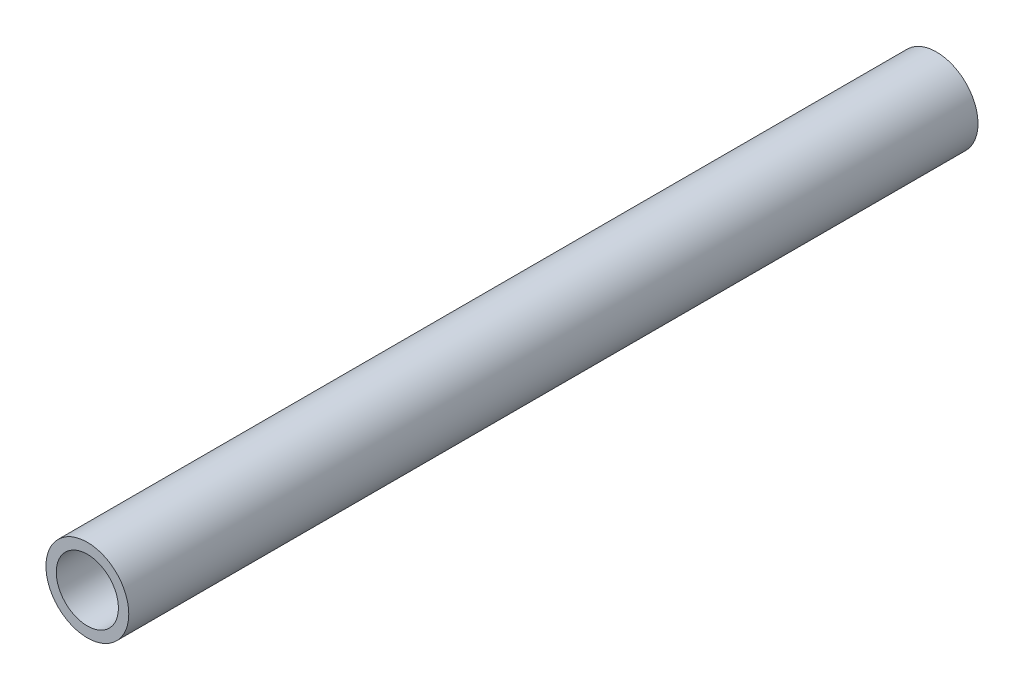
ISO-10303-21;
HEADER;
FILE_DESCRIPTION(('STEP AP214'),'2;1');
FILE_NAME('part.step','',(''),(''),'','','');
FILE_SCHEMA(('AUTOMOTIVE_DESIGN { 1 0 10303 214 1 1 1 1 }'));
ENDSEC;
DATA;
#1=APPLICATION_CONTEXT('core data for automotive mechanical design processes');
#2=APPLICATION_PROTOCOL_DEFINITION('international standard','automotive_design',2000,#1);
#3=PRODUCT_CONTEXT('',#1,'mechanical');
#4=PRODUCT('Part','Part','',(#3));
#5=PRODUCT_RELATED_PRODUCT_CATEGORY('part','',(#4));
#6=PRODUCT_DEFINITION_FORMATION('','',#4);
#7=PRODUCT_DEFINITION_CONTEXT('part definition',#1,'design');
#8=PRODUCT_DEFINITION('design','',#6,#7);
#9=PRODUCT_DEFINITION_SHAPE('','',#8);
#10=(LENGTH_UNIT() NAMED_UNIT(*) SI_UNIT(.MILLI.,.METRE.));
#11=(NAMED_UNIT(*) PLANE_ANGLE_UNIT() SI_UNIT($,.RADIAN.));
#12=(NAMED_UNIT(*) SI_UNIT($,.STERADIAN.) SOLID_ANGLE_UNIT());
#13=UNCERTAINTY_MEASURE_WITH_UNIT(LENGTH_MEASURE(1.E-05),#10,'distance_accuracy_value','');
#14=(GEOMETRIC_REPRESENTATION_CONTEXT(3) GLOBAL_UNCERTAINTY_ASSIGNED_CONTEXT((#13)) GLOBAL_UNIT_ASSIGNED_CONTEXT((#10,
#11,#12)) REPRESENTATION_CONTEXT('',''));
#15=CARTESIAN_POINT('',(0.,0.,0.));
#16=DIRECTION('',(0.,0.,1.));
#17=DIRECTION('',(1.,0.,0.));
#18=AXIS2_PLACEMENT_3D('',#15,#16,#17);
#19=CARTESIAN_POINT('',(0.,0.,27.5));
#20=DIRECTION('',(0.,0.,1.));
#21=DIRECTION('',(1.,0.,0.));
#22=AXIS2_PLACEMENT_3D('',#19,#20,#21);
#23=CYLINDRICAL_SURFACE('',#22,1.5);
#24=DIRECTION('',(0.,0.,1.));
#25=VECTOR('',#24,1.);
#26=CARTESIAN_POINT('',(1.5,0.,27.5));
#27=LINE('',#26,#25);
#28=CARTESIAN_POINT('',(1.5,0.,27.6));
#29=VERTEX_POINT('',#28);
#30=CARTESIAN_POINT('',(1.5,0.,68.597614996343));
#31=VERTEX_POINT('',#30);
#32=EDGE_CURVE('E10',#29,#31,#27,.T.);
#33=ORIENTED_EDGE('',*,*,#32,.F.);
#34=CARTESIAN_POINT('',(0.,0.,27.6));
#35=DIRECTION('',(0.,0.,1.));
#36=DIRECTION('',(1.,0.,0.));
#37=AXIS2_PLACEMENT_3D('',#34,#35,#36);
#38=CIRCLE('',#37,1.5);
#39=EDGE_CURVE('E25',#29,#29,#38,.T.);
#40=ORIENTED_EDGE('',*,*,#39,.F.);
#41=ORIENTED_EDGE('',*,*,#32,.T.);
#42=CARTESIAN_POINT('',(0.,0.,68.597614996343));
#43=DIRECTION('',(0.,0.,1.));
#44=DIRECTION('',(1.,0.,0.));
#45=AXIS2_PLACEMENT_3D('',#42,#43,#44);
#46=CIRCLE('',#45,1.5);
#47=EDGE_CURVE('E55',#31,#31,#46,.T.);
#48=ORIENTED_EDGE('',*,*,#47,.T.);
#49=EDGE_LOOP('',(#33,#40,#41,#48));
#50=FACE_BOUND('',#49,.T.);
#51=ADVANCED_FACE('F15',(#50),#23,.F.);
#52=CARTESIAN_POINT('',(0.,0.,27.6));
#53=DIRECTION('',(0.,0.,1.));
#54=DIRECTION('',(1.,0.,0.));
#55=AXIS2_PLACEMENT_3D('',#52,#53,#54);
#56=PLANE('',#55);
#57=ORIENTED_EDGE('',*,*,#39,.T.);
#58=EDGE_LOOP('',(#57));
#59=FACE_BOUND('',#58,.T.);
#60=CARTESIAN_POINT('',(0.,0.,27.6));
#61=DIRECTION('',(0.,0.,1.));
#62=DIRECTION('',(1.,0.,0.));
#63=AXIS2_PLACEMENT_3D('',#60,#61,#62);
#64=CIRCLE('',#63,2.);
#65=CARTESIAN_POINT('',(2.,0.,27.6));
#66=VERTEX_POINT('',#65);
#67=EDGE_CURVE('E52',#66,#66,#64,.T.);
#68=ORIENTED_EDGE('',*,*,#67,.F.);
#69=EDGE_LOOP('',(#68));
#70=FACE_BOUND('',#69,.T.);
#71=ADVANCED_FACE('F70',(#59,#70),#56,.F.);
#72=CARTESIAN_POINT('',(0.,0.,68.597614996343));
#73=DIRECTION('',(0.,0.,1.));
#74=DIRECTION('',(1.,0.,0.));
#75=AXIS2_PLACEMENT_3D('',#72,#73,#74);
#76=PLANE('',#75);
#77=ORIENTED_EDGE('',*,*,#47,.F.);
#78=EDGE_LOOP('',(#77));
#79=FACE_BOUND('',#78,.T.);
#80=CARTESIAN_POINT('',(0.,0.,68.597614996343));
#81=DIRECTION('',(0.,0.,1.));
#82=DIRECTION('',(1.,0.,0.));
#83=AXIS2_PLACEMENT_3D('',#80,#81,#82);
#84=CIRCLE('',#83,2.);
#85=CARTESIAN_POINT('',(2.,0.,68.597614996343));
#86=VERTEX_POINT('',#85);
#87=EDGE_CURVE('E60',#86,#86,#84,.T.);
#88=ORIENTED_EDGE('',*,*,#87,.T.);
#89=EDGE_LOOP('',(#88));
#90=FACE_BOUND('',#89,.T.);
#91=ADVANCED_FACE('F68',(#79,#90),#76,.T.);
#92=CARTESIAN_POINT('',(0.,0.,27.6));
#93=DIRECTION('',(0.,0.,1.));
#94=DIRECTION('',(1.,0.,0.));
#95=AXIS2_PLACEMENT_3D('',#92,#93,#94);
#96=CYLINDRICAL_SURFACE('',#95,2.);
#97=ORIENTED_EDGE('',*,*,#87,.F.);
#98=DIRECTION('',(0.,0.,1.));
#99=VECTOR('',#98,1.);
#100=CARTESIAN_POINT('',(2.,0.,27.6));
#101=LINE('',#100,#99);
#102=EDGE_CURVE('E47',#66,#86,#101,.T.);
#103=ORIENTED_EDGE('',*,*,#102,.F.);
#104=ORIENTED_EDGE('',*,*,#67,.T.);
#105=ORIENTED_EDGE('',*,*,#102,.T.);
#106=EDGE_LOOP('',(#97,#103,#104,#105));
#107=FACE_BOUND('',#106,.T.);
#108=ADVANCED_FACE('F17',(#107),#96,.T.);
#109=CLOSED_SHELL('',(#51,#71,#91,#108));
#110=MANIFOLD_SOLID_BREP('B1',#109);
#111=ADVANCED_BREP_SHAPE_REPRESENTATION('',(#18,#110),#14);
#112=SHAPE_DEFINITION_REPRESENTATION(#9,#111);
ENDSEC;
END-ISO-10303-21;
